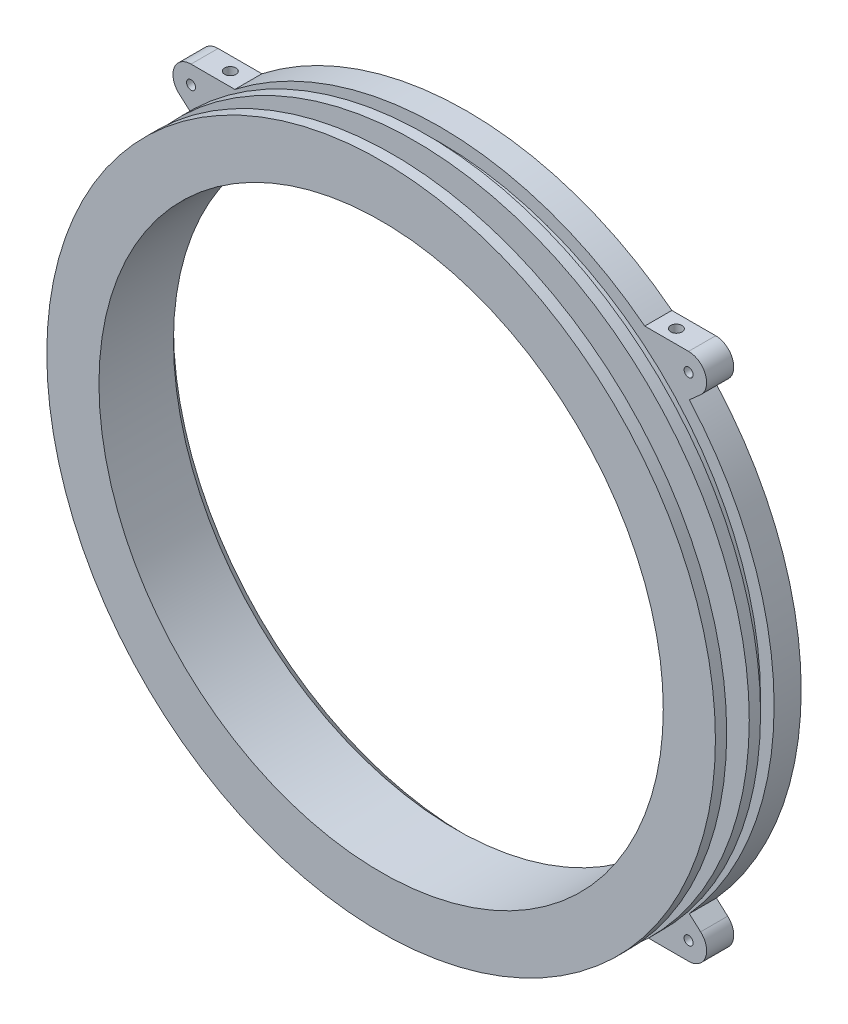
ISO-10303-21;
HEADER;
FILE_DESCRIPTION(('STEP AP214'),'2;1');
FILE_NAME('part.step','',(''),(''),'','','');
FILE_SCHEMA(('AUTOMOTIVE_DESIGN { 1 0 10303 214 1 1 1 1 }'));
ENDSEC;
DATA;
#1=APPLICATION_CONTEXT('core data for automotive mechanical design processes');
#2=APPLICATION_PROTOCOL_DEFINITION('international standard','automotive_design',2000,#1);
#3=PRODUCT_CONTEXT('',#1,'mechanical');
#4=PRODUCT('Part','Part','',(#3));
#5=PRODUCT_RELATED_PRODUCT_CATEGORY('part','',(#4));
#6=PRODUCT_DEFINITION_FORMATION('','',#4);
#7=PRODUCT_DEFINITION_CONTEXT('part definition',#1,'design');
#8=PRODUCT_DEFINITION('design','',#6,#7);
#9=PRODUCT_DEFINITION_SHAPE('','',#8);
#10=(LENGTH_UNIT() NAMED_UNIT(*) SI_UNIT(.MILLI.,.METRE.));
#11=(NAMED_UNIT(*) PLANE_ANGLE_UNIT() SI_UNIT($,.RADIAN.));
#12=(NAMED_UNIT(*) SI_UNIT($,.STERADIAN.) SOLID_ANGLE_UNIT());
#13=UNCERTAINTY_MEASURE_WITH_UNIT(LENGTH_MEASURE(1.E-05),#10,'distance_accuracy_value','');
#14=(GEOMETRIC_REPRESENTATION_CONTEXT(3) GLOBAL_UNCERTAINTY_ASSIGNED_CONTEXT((#13)) GLOBAL_UNIT_ASSIGNED_CONTEXT((#10,
#11,#12)) REPRESENTATION_CONTEXT('',''));
#15=CARTESIAN_POINT('',(0.,0.,0.));
#16=DIRECTION('',(0.,0.,1.));
#17=DIRECTION('',(1.,0.,0.));
#18=AXIS2_PLACEMENT_3D('',#15,#16,#17);
#19=CARTESIAN_POINT('',(0.,0.,12.));
#20=DIRECTION('',(0.,0.,-1.));
#21=DIRECTION('',(-1.,0.,0.));
#22=AXIS2_PLACEMENT_3D('',#19,#20,#21);
#23=CYLINDRICAL_SURFACE('',#22,148.1);
#24=DIRECTION('',(0.,0.,-1.));
#25=VECTOR('',#24,1.);
#26=CARTESIAN_POINT('',(-110.532726589017,-98.5704131714865,12.));
#27=LINE('',#26,#25);
#28=CARTESIAN_POINT('',(-110.532726589017,-98.5704131714865,12.));
#29=VERTEX_POINT('',#28);
#30=CARTESIAN_POINT('',(-110.532726589017,-98.5704131714865,0.));
#31=VERTEX_POINT('',#30);
#32=EDGE_CURVE('E63',#29,#31,#27,.T.);
#33=ORIENTED_EDGE('',*,*,#32,.F.);
#34=CARTESIAN_POINT('',(0.,0.,12.));
#35=DIRECTION('',(0.,0.,1.));
#36=DIRECTION('',(1.,0.,0.));
#37=AXIS2_PLACEMENT_3D('',#34,#35,#36);
#38=CIRCLE('',#37,148.1);
#39=CARTESIAN_POINT('',(-110.532726589017,98.5704131714865,12.));
#40=VERTEX_POINT('',#39);
#41=EDGE_CURVE('E161',#40,#29,#38,.T.);
#42=ORIENTED_EDGE('',*,*,#41,.F.);
#43=DIRECTION('',(0.,0.,-1.));
#44=VECTOR('',#43,1.);
#45=CARTESIAN_POINT('',(-110.532726589017,98.5704131714865,12.));
#46=LINE('',#45,#44);
#47=CARTESIAN_POINT('',(-110.532726589017,98.5704131714865,0.));
#48=VERTEX_POINT('',#47);
#49=EDGE_CURVE('E272',#40,#48,#46,.T.);
#50=ORIENTED_EDGE('',*,*,#49,.T.);
#51=CARTESIAN_POINT('',(0.,0.,0.));
#52=DIRECTION('',(0.,0.,1.));
#53=DIRECTION('',(1.,0.,0.));
#54=AXIS2_PLACEMENT_3D('',#51,#52,#53);
#55=CIRCLE('',#54,148.1);
#56=EDGE_CURVE('E318',#48,#31,#55,.T.);
#57=ORIENTED_EDGE('',*,*,#56,.T.);
#58=EDGE_LOOP('',(#33,#42,#50,#57));
#59=FACE_BOUND('',#58,.T.);
#60=ADVANCED_FACE('F40',(#59),#23,.T.);
#61=DIRECTION('',(0.,0.,-1.));
#62=VECTOR('',#61,1.);
#63=CARTESIAN_POINT('',(-90.7998348016119,-117.,12.));
#64=LINE('',#63,#62);
#65=CARTESIAN_POINT('',(-90.7998348016119,-117.,12.));
#66=VERTEX_POINT('',#65);
#67=CARTESIAN_POINT('',(-90.7998348016119,-117.,0.));
#68=VERTEX_POINT('',#67);
#69=EDGE_CURVE('E179',#66,#68,#64,.T.);
#70=ORIENTED_EDGE('',*,*,#69,.T.);
#71=CARTESIAN_POINT('',(90.7998348016119,-117.,0.));
#72=VERTEX_POINT('',#71);
#73=EDGE_CURVE('E319',#68,#72,#55,.T.);
#74=ORIENTED_EDGE('',*,*,#73,.T.);
#75=DIRECTION('',(0.,0.,-1.));
#76=VECTOR('',#75,1.);
#77=CARTESIAN_POINT('',(90.799834801612,-117.,12.));
#78=LINE('',#77,#76);
#79=CARTESIAN_POINT('',(90.7998348016119,-117.,12.));
#80=VERTEX_POINT('',#79);
#81=EDGE_CURVE('E217',#80,#72,#78,.T.);
#82=ORIENTED_EDGE('',*,*,#81,.F.);
#83=EDGE_CURVE('E55',#66,#80,#38,.T.);
#84=ORIENTED_EDGE('',*,*,#83,.F.);
#85=EDGE_LOOP('',(#70,#74,#82,#84));
#86=FACE_BOUND('',#85,.T.);
#87=ADVANCED_FACE('F337',(#86),#23,.T.);
#88=DIRECTION('',(0.,0.,-1.));
#89=VECTOR('',#88,1.);
#90=CARTESIAN_POINT('',(110.532726589017,-98.5704131714865,12.));
#91=LINE('',#90,#89);
#92=CARTESIAN_POINT('',(110.532726589017,-98.5704131714865,12.));
#93=VERTEX_POINT('',#92);
#94=CARTESIAN_POINT('',(110.532726589017,-98.5704131714865,0.));
#95=VERTEX_POINT('',#94);
#96=EDGE_CURVE('E220',#93,#95,#91,.T.);
#97=ORIENTED_EDGE('',*,*,#96,.T.);
#98=CARTESIAN_POINT('',(110.532726589017,98.5704131714865,0.));
#99=VERTEX_POINT('',#98);
#100=EDGE_CURVE('E353',#95,#99,#55,.T.);
#101=ORIENTED_EDGE('',*,*,#100,.T.);
#102=DIRECTION('',(0.,0.,-1.));
#103=VECTOR('',#102,1.);
#104=CARTESIAN_POINT('',(110.532726589017,98.5704131714865,12.));
#105=LINE('',#104,#103);
#106=CARTESIAN_POINT('',(110.532726589017,98.5704131714865,12.));
#107=VERTEX_POINT('',#106);
#108=EDGE_CURVE('E255',#107,#99,#105,.T.);
#109=ORIENTED_EDGE('',*,*,#108,.F.);
#110=EDGE_CURVE('E355',#93,#107,#38,.T.);
#111=ORIENTED_EDGE('',*,*,#110,.F.);
#112=EDGE_LOOP('',(#97,#101,#109,#111));
#113=FACE_BOUND('',#112,.T.);
#114=ADVANCED_FACE('F338',(#113),#23,.T.);
#115=DIRECTION('',(0.,0.,-1.));
#116=VECTOR('',#115,1.);
#117=CARTESIAN_POINT('',(90.7998348016119,117.,12.));
#118=LINE('',#117,#116);
#119=CARTESIAN_POINT('',(90.7998348016119,117.,12.));
#120=VERTEX_POINT('',#119);
#121=CARTESIAN_POINT('',(90.7998348016119,117.,0.));
#122=VERTEX_POINT('',#121);
#123=EDGE_CURVE('E241',#120,#122,#118,.T.);
#124=ORIENTED_EDGE('',*,*,#123,.T.);
#125=CARTESIAN_POINT('',(-90.7998348016119,117.,0.));
#126=VERTEX_POINT('',#125);
#127=EDGE_CURVE('E312',#122,#126,#55,.T.);
#128=ORIENTED_EDGE('',*,*,#127,.T.);
#129=DIRECTION('',(0.,0.,-1.));
#130=VECTOR('',#129,1.);
#131=CARTESIAN_POINT('',(-90.7998348016119,117.,12.));
#132=LINE('',#131,#130);
#133=CARTESIAN_POINT('',(-90.7998348016119,117.,12.));
#134=VERTEX_POINT('',#133);
#135=EDGE_CURVE('E285',#134,#126,#132,.T.);
#136=ORIENTED_EDGE('',*,*,#135,.F.);
#137=EDGE_CURVE('E317',#120,#134,#38,.T.);
#138=ORIENTED_EDGE('',*,*,#137,.F.);
#139=EDGE_LOOP('',(#124,#128,#136,#138));
#140=FACE_BOUND('',#139,.T.);
#141=ADVANCED_FACE('F342',(#140),#23,.T.);
#142=CARTESIAN_POINT('',(0.,0.,23.));
#143=DIRECTION('',(0.,0.,1.));
#144=DIRECTION('',(1.,0.,0.));
#145=AXIS2_PLACEMENT_3D('',#142,#143,#144);
#146=PLANE('',#145);
#147=CARTESIAN_POINT('',(0.,0.,23.));
#148=DIRECTION('',(0.,0.,1.));
#149=DIRECTION('',(1.,0.,0.));
#150=AXIS2_PLACEMENT_3D('',#147,#148,#149);
#151=CIRCLE('',#150,148.1);
#152=CARTESIAN_POINT('',(148.1,0.,23.));
#153=VERTEX_POINT('',#152);
#154=EDGE_CURVE('E304',#153,#153,#151,.T.);
#155=ORIENTED_EDGE('',*,*,#154,.T.);
#156=EDGE_LOOP('',(#155));
#157=FACE_BOUND('',#156,.T.);
#158=CARTESIAN_POINT('',(0.,0.,23.));
#159=DIRECTION('',(0.,0.,1.));
#160=DIRECTION('',(1.,0.,0.));
#161=AXIS2_PLACEMENT_3D('',#158,#159,#160);
#162=CIRCLE('',#161,133.1);
#163=CARTESIAN_POINT('',(133.1,0.,23.));
#164=VERTEX_POINT('',#163);
#165=EDGE_CURVE('E295',#164,#164,#162,.T.);
#166=ORIENTED_EDGE('',*,*,#165,.F.);
#167=EDGE_LOOP('',(#166));
#168=FACE_BOUND('',#167,.T.);
#169=ADVANCED_FACE('F349',(#157,#168),#146,.T.);
#170=CARTESIAN_POINT('',(0.,0.,12.));
#171=DIRECTION('',(0.,0.,1.));
#172=DIRECTION('',(1.,0.,0.));
#173=AXIS2_PLACEMENT_3D('',#170,#171,#172);
#174=PLANE('',#173);
#175=CARTESIAN_POINT('',(0.,0.,12.));
#176=DIRECTION('',(0.,0.,1.));
#177=DIRECTION('',(1.,0.,0.));
#178=AXIS2_PLACEMENT_3D('',#175,#176,#177);
#179=CIRCLE('',#178,142.1);
#180=CARTESIAN_POINT('',(142.1,0.,12.));
#181=VERTEX_POINT('',#180);
#182=EDGE_CURVE('E313',#181,#181,#179,.T.);
#183=ORIENTED_EDGE('',*,*,#182,.F.);
#184=EDGE_LOOP('',(#183));
#185=FACE_BOUND('',#184,.T.);
#186=ORIENTED_EDGE('',*,*,#41,.T.);
#187=DIRECTION('',(-0.746338464476822,-0.6655665980519,0.));
#188=VECTOR('',#187,1.);
#189=CARTESIAN_POINT('',(-115.532726589017,-103.029292284185,12.));
#190=LINE('',#189,#188);
#191=CARTESIAN_POINT('',(-115.532726589017,-103.029292284185,12.));
#192=VERTEX_POINT('',#191);
#193=EDGE_CURVE('E153',#29,#192,#190,.T.);
#194=ORIENTED_EDGE('',*,*,#193,.T.);
#195=CARTESIAN_POINT('',(-110.208193804602,-109.,12.));
#196=DIRECTION('',(0.,0.,1.));
#197=DIRECTION('',(-1.,0.,0.));
#198=AXIS2_PLACEMENT_3D('',#195,#196,#197);
#199=CIRCLE('',#198,7.99999999999999);
#200=CARTESIAN_POINT('',(-110.208193804602,-117.,12.));
#201=VERTEX_POINT('',#200);
#202=EDGE_CURVE('E158',#192,#201,#199,.T.);
#203=ORIENTED_EDGE('',*,*,#202,.T.);
#204=DIRECTION('',(1.,0.,0.));
#205=VECTOR('',#204,1.);
#206=CARTESIAN_POINT('',(-90.7998348016119,-117.,12.));
#207=LINE('',#206,#205);
#208=EDGE_CURVE('E177',#201,#66,#207,.T.);
#209=ORIENTED_EDGE('',*,*,#208,.T.);
#210=ORIENTED_EDGE('',*,*,#83,.T.);
#211=DIRECTION('',(1.,0.,0.));
#212=VECTOR('',#211,1.);
#213=CARTESIAN_POINT('',(90.7998348016119,-117.,12.));
#214=LINE('',#213,#212);
#215=CARTESIAN_POINT('',(110.208193804602,-117.,12.));
#216=VERTEX_POINT('',#215);
#217=EDGE_CURVE('E206',#80,#216,#214,.T.);
#218=ORIENTED_EDGE('',*,*,#217,.T.);
#219=CARTESIAN_POINT('',(110.208193804602,-109.,12.));
#220=DIRECTION('',(0.,0.,1.));
#221=DIRECTION('',(1.,0.,0.));
#222=AXIS2_PLACEMENT_3D('',#219,#220,#221);
#223=CIRCLE('',#222,7.99999999999999);
#224=CARTESIAN_POINT('',(115.532726589017,-103.029292284185,12.));
#225=VERTEX_POINT('',#224);
#226=EDGE_CURVE('E199',#216,#225,#223,.T.);
#227=ORIENTED_EDGE('',*,*,#226,.T.);
#228=DIRECTION('',(-0.746338464476822,0.6655665980519,0.));
#229=VECTOR('',#228,1.);
#230=CARTESIAN_POINT('',(115.532726589017,-103.029292284185,12.));
#231=LINE('',#230,#229);
#232=EDGE_CURVE('E202',#225,#93,#231,.T.);
#233=ORIENTED_EDGE('',*,*,#232,.T.);
#234=ORIENTED_EDGE('',*,*,#110,.T.);
#235=DIRECTION('',(0.746338464476822,0.6655665980519,0.));
#236=VECTOR('',#235,1.);
#237=CARTESIAN_POINT('',(115.532726589017,103.029292284185,12.));
#238=LINE('',#237,#236);
#239=CARTESIAN_POINT('',(115.532726589017,103.029292284185,12.));
#240=VERTEX_POINT('',#239);
#241=EDGE_CURVE('E233',#107,#240,#238,.T.);
#242=ORIENTED_EDGE('',*,*,#241,.T.);
#243=CARTESIAN_POINT('',(110.208193804602,109.,12.));
#244=DIRECTION('',(0.,0.,1.));
#245=DIRECTION('',(-1.,0.,0.));
#246=AXIS2_PLACEMENT_3D('',#243,#244,#245);
#247=CIRCLE('',#246,7.99999999999999);
#248=CARTESIAN_POINT('',(110.208193804602,117.,12.));
#249=VERTEX_POINT('',#248);
#250=EDGE_CURVE('E235',#240,#249,#247,.T.);
#251=ORIENTED_EDGE('',*,*,#250,.T.);
#252=DIRECTION('',(-1.,0.,0.));
#253=VECTOR('',#252,1.);
#254=CARTESIAN_POINT('',(90.7998348016119,117.,12.));
#255=LINE('',#254,#253);
#256=EDGE_CURVE('E238',#249,#120,#255,.T.);
#257=ORIENTED_EDGE('',*,*,#256,.T.);
#258=ORIENTED_EDGE('',*,*,#137,.T.);
#259=DIRECTION('',(-1.,0.,0.));
#260=VECTOR('',#259,1.);
#261=CARTESIAN_POINT('',(-90.7998348016119,117.,12.));
#262=LINE('',#261,#260);
#263=CARTESIAN_POINT('',(-110.208193804602,117.,12.));
#264=VERTEX_POINT('',#263);
#265=EDGE_CURVE('E265',#134,#264,#262,.T.);
#266=ORIENTED_EDGE('',*,*,#265,.T.);
#267=CARTESIAN_POINT('',(-110.208193804602,109.,12.));
#268=DIRECTION('',(0.,0.,1.));
#269=DIRECTION('',(1.,0.,0.));
#270=AXIS2_PLACEMENT_3D('',#267,#268,#269);
#271=CIRCLE('',#270,7.99999999999999);
#272=CARTESIAN_POINT('',(-115.532726589017,103.029292284185,12.));
#273=VERTEX_POINT('',#272);
#274=EDGE_CURVE('E267',#264,#273,#271,.T.);
#275=ORIENTED_EDGE('',*,*,#274,.T.);
#276=DIRECTION('',(0.746338464476822,-0.6655665980519,0.));
#277=VECTOR('',#276,1.);
#278=CARTESIAN_POINT('',(-115.532726589017,103.029292284185,12.));
#279=LINE('',#278,#277);
#280=EDGE_CURVE('E270',#273,#40,#279,.T.);
#281=ORIENTED_EDGE('',*,*,#280,.T.);
#282=EDGE_LOOP('',(#186,#194,#203,#209,#210,#218,#227,#233,#234,#242,#251,#257,#258,#266,#275,#281));
#283=FACE_BOUND('',#282,.T.);
#284=CARTESIAN_POINT('',(-110.208193804602,109.,12.));
#285=DIRECTION('',(0.,0.,1.));
#286=DIRECTION('',(1.,0.,0.));
#287=AXIS2_PLACEMENT_3D('',#284,#285,#286);
#288=CIRCLE('',#287,2.);
#289=CARTESIAN_POINT('',(-108.208193804602,109.,12.));
#290=VERTEX_POINT('',#289);
#291=EDGE_CURVE('E259',#290,#290,#288,.T.);
#292=ORIENTED_EDGE('',*,*,#291,.F.);
#293=EDGE_LOOP('',(#292));
#294=FACE_BOUND('',#293,.T.);
#295=CARTESIAN_POINT('',(110.208193804602,109.,12.));
#296=DIRECTION('',(0.,0.,1.));
#297=DIRECTION('',(-1.,0.,0.));
#298=AXIS2_PLACEMENT_3D('',#295,#296,#297);
#299=CIRCLE('',#298,2.);
#300=CARTESIAN_POINT('',(108.208193804602,109.,12.));
#301=VERTEX_POINT('',#300);
#302=EDGE_CURVE('E227',#301,#301,#299,.T.);
#303=ORIENTED_EDGE('',*,*,#302,.F.);
#304=EDGE_LOOP('',(#303));
#305=FACE_BOUND('',#304,.T.);
#306=CARTESIAN_POINT('',(110.208193804602,-109.,12.));
#307=DIRECTION('',(0.,0.,1.));
#308=DIRECTION('',(1.,0.,0.));
#309=AXIS2_PLACEMENT_3D('',#306,#307,#308);
#310=CIRCLE('',#309,2.);
#311=CARTESIAN_POINT('',(112.208193804602,-109.,12.));
#312=VERTEX_POINT('',#311);
#313=EDGE_CURVE('E193',#312,#312,#310,.T.);
#314=ORIENTED_EDGE('',*,*,#313,.F.);
#315=EDGE_LOOP('',(#314));
#316=FACE_BOUND('',#315,.T.);
#317=CARTESIAN_POINT('',(-110.208193804602,-109.,12.));
#318=DIRECTION('',(0.,0.,1.));
#319=DIRECTION('',(-1.,0.,0.));
#320=AXIS2_PLACEMENT_3D('',#317,#318,#319);
#321=CIRCLE('',#320,2.);
#322=CARTESIAN_POINT('',(-112.208193804602,-109.,12.));
#323=VERTEX_POINT('',#322);
#324=EDGE_CURVE('E185',#323,#323,#321,.T.);
#325=ORIENTED_EDGE('',*,*,#324,.F.);
#326=EDGE_LOOP('',(#325));
#327=FACE_BOUND('',#326,.T.);
#328=ADVANCED_FACE('F155',(#185,#283,#294,#305,#316,#327),#174,.T.);
#329=CARTESIAN_POINT('',(0.,0.,0.));
#330=DIRECTION('',(0.,0.,1.));
#331=DIRECTION('',(1.,0.,0.));
#332=AXIS2_PLACEMENT_3D('',#329,#330,#331);
#333=PLANE('',#332);
#334=CARTESIAN_POINT('',(0.,0.,0.));
#335=DIRECTION('',(0.,0.,1.));
#336=DIRECTION('',(1.,0.,0.));
#337=AXIS2_PLACEMENT_3D('',#334,#335,#336);
#338=CIRCLE('',#337,130.);
#339=CARTESIAN_POINT('',(130.,0.,0.));
#340=VERTEX_POINT('',#339);
#341=EDGE_CURVE('E48',#340,#340,#338,.T.);
#342=ORIENTED_EDGE('',*,*,#341,.T.);
#343=EDGE_LOOP('',(#342));
#344=FACE_BOUND('',#343,.T.);
#345=ORIENTED_EDGE('',*,*,#56,.F.);
#346=DIRECTION('',(0.746338464476822,-0.6655665980519,0.));
#347=VECTOR('',#346,1.);
#348=CARTESIAN_POINT('',(-115.532726589017,103.029292284185,0.));
#349=LINE('',#348,#347);
#350=CARTESIAN_POINT('',(-115.532726589017,103.029292284185,0.));
#351=VERTEX_POINT('',#350);
#352=EDGE_CURVE('E268',#351,#48,#349,.T.);
#353=ORIENTED_EDGE('',*,*,#352,.F.);
#354=CARTESIAN_POINT('',(-110.208193804602,109.,0.));
#355=DIRECTION('',(0.,0.,1.));
#356=DIRECTION('',(1.,0.,0.));
#357=AXIS2_PLACEMENT_3D('',#354,#355,#356);
#358=CIRCLE('',#357,7.99999999999999);
#359=CARTESIAN_POINT('',(-110.208193804602,117.,0.));
#360=VERTEX_POINT('',#359);
#361=EDGE_CURVE('E274',#360,#351,#358,.T.);
#362=ORIENTED_EDGE('',*,*,#361,.F.);
#363=DIRECTION('',(-1.,0.,0.));
#364=VECTOR('',#363,1.);
#365=CARTESIAN_POINT('',(-90.7998348016119,117.,0.));
#366=LINE('',#365,#364);
#367=EDGE_CURVE('E262',#126,#360,#366,.T.);
#368=ORIENTED_EDGE('',*,*,#367,.F.);
#369=ORIENTED_EDGE('',*,*,#127,.F.);
#370=DIRECTION('',(-1.,0.,0.));
#371=VECTOR('',#370,1.);
#372=CARTESIAN_POINT('',(90.7998348016119,117.,0.));
#373=LINE('',#372,#371);
#374=CARTESIAN_POINT('',(110.208193804602,117.,0.));
#375=VERTEX_POINT('',#374);
#376=EDGE_CURVE('E236',#375,#122,#373,.T.);
#377=ORIENTED_EDGE('',*,*,#376,.F.);
#378=CARTESIAN_POINT('',(110.208193804602,109.,0.));
#379=DIRECTION('',(0.,0.,1.));
#380=DIRECTION('',(-1.,0.,0.));
#381=AXIS2_PLACEMENT_3D('',#378,#379,#380);
#382=CIRCLE('',#381,7.99999999999999);
#383=CARTESIAN_POINT('',(115.532726589017,103.029292284185,0.));
#384=VERTEX_POINT('',#383);
#385=EDGE_CURVE('E243',#384,#375,#382,.T.);
#386=ORIENTED_EDGE('',*,*,#385,.F.);
#387=DIRECTION('',(0.746338464476822,0.6655665980519,0.));
#388=VECTOR('',#387,1.);
#389=CARTESIAN_POINT('',(115.532726589017,103.029292284185,0.));
#390=LINE('',#389,#388);
#391=EDGE_CURVE('E230',#99,#384,#390,.T.);
#392=ORIENTED_EDGE('',*,*,#391,.F.);
#393=ORIENTED_EDGE('',*,*,#100,.F.);
#394=DIRECTION('',(-0.746338464476822,0.6655665980519,0.));
#395=VECTOR('',#394,1.);
#396=CARTESIAN_POINT('',(115.532726589017,-103.029292284185,0.));
#397=LINE('',#396,#395);
#398=CARTESIAN_POINT('',(115.532726589017,-103.029292284185,0.));
#399=VERTEX_POINT('',#398);
#400=EDGE_CURVE('E211',#399,#95,#397,.T.);
#401=ORIENTED_EDGE('',*,*,#400,.F.);
#402=CARTESIAN_POINT('',(110.208193804602,-109.,0.));
#403=DIRECTION('',(0.,0.,1.));
#404=DIRECTION('',(1.,0.,0.));
#405=AXIS2_PLACEMENT_3D('',#402,#403,#404);
#406=CIRCLE('',#405,7.99999999999999);
#407=CARTESIAN_POINT('',(110.208193804602,-117.,0.));
#408=VERTEX_POINT('',#407);
#409=EDGE_CURVE('E196',#408,#399,#406,.T.);
#410=ORIENTED_EDGE('',*,*,#409,.F.);
#411=DIRECTION('',(1.,0.,0.));
#412=VECTOR('',#411,1.);
#413=CARTESIAN_POINT('',(90.7998348016119,-117.,0.));
#414=LINE('',#413,#412);
#415=EDGE_CURVE('E203',#72,#408,#414,.T.);
#416=ORIENTED_EDGE('',*,*,#415,.F.);
#417=ORIENTED_EDGE('',*,*,#73,.F.);
#418=DIRECTION('',(1.,0.,0.));
#419=VECTOR('',#418,1.);
#420=CARTESIAN_POINT('',(-90.7998348016119,-117.,0.));
#421=LINE('',#420,#419);
#422=CARTESIAN_POINT('',(-110.208193804602,-117.,0.));
#423=VERTEX_POINT('',#422);
#424=EDGE_CURVE('E163',#423,#68,#421,.T.);
#425=ORIENTED_EDGE('',*,*,#424,.F.);
#426=CARTESIAN_POINT('',(-110.208193804602,-109.,0.));
#427=DIRECTION('',(0.,0.,1.));
#428=DIRECTION('',(-1.,0.,0.));
#429=AXIS2_PLACEMENT_3D('',#426,#427,#428);
#430=CIRCLE('',#429,7.99999999999999);
#431=CARTESIAN_POINT('',(-115.532726589017,-103.029292284185,0.));
#432=VERTEX_POINT('',#431);
#433=EDGE_CURVE('E184',#432,#423,#430,.T.);
#434=ORIENTED_EDGE('',*,*,#433,.F.);
#435=DIRECTION('',(-0.746338464476822,-0.6655665980519,0.));
#436=VECTOR('',#435,1.);
#437=CARTESIAN_POINT('',(-115.532726589017,-103.029292284185,0.));
#438=LINE('',#437,#436);
#439=EDGE_CURVE('E169',#31,#432,#438,.T.);
#440=ORIENTED_EDGE('',*,*,#439,.F.);
#441=EDGE_LOOP('',(#345,#353,#362,#368,#369,#377,#386,#392,#393,#401,#410,#416,#417,#425,#434,#440));
#442=FACE_BOUND('',#441,.T.);
#443=CARTESIAN_POINT('',(-110.208193804602,109.,0.));
#444=DIRECTION('',(0.,0.,1.));
#445=DIRECTION('',(1.,0.,0.));
#446=AXIS2_PLACEMENT_3D('',#443,#444,#445);
#447=CIRCLE('',#446,2.);
#448=CARTESIAN_POINT('',(-108.208193804602,109.,0.));
#449=VERTEX_POINT('',#448);
#450=EDGE_CURVE('E258',#449,#449,#447,.T.);
#451=ORIENTED_EDGE('',*,*,#450,.T.);
#452=EDGE_LOOP('',(#451));
#453=FACE_BOUND('',#452,.T.);
#454=CARTESIAN_POINT('',(110.208193804602,109.,0.));
#455=DIRECTION('',(0.,0.,1.));
#456=DIRECTION('',(-1.,0.,0.));
#457=AXIS2_PLACEMENT_3D('',#454,#455,#456);
#458=CIRCLE('',#457,2.);
#459=CARTESIAN_POINT('',(108.208193804602,109.,0.));
#460=VERTEX_POINT('',#459);
#461=EDGE_CURVE('E226',#460,#460,#458,.T.);
#462=ORIENTED_EDGE('',*,*,#461,.T.);
#463=EDGE_LOOP('',(#462));
#464=FACE_BOUND('',#463,.T.);
#465=CARTESIAN_POINT('',(110.208193804602,-109.,0.));
#466=DIRECTION('',(0.,0.,1.));
#467=DIRECTION('',(1.,0.,0.));
#468=AXIS2_PLACEMENT_3D('',#465,#466,#467);
#469=CIRCLE('',#468,2.);
#470=CARTESIAN_POINT('',(112.208193804602,-109.,0.));
#471=VERTEX_POINT('',#470);
#472=EDGE_CURVE('E192',#471,#471,#469,.T.);
#473=ORIENTED_EDGE('',*,*,#472,.T.);
#474=EDGE_LOOP('',(#473));
#475=FACE_BOUND('',#474,.T.);
#476=CARTESIAN_POINT('',(-110.208193804602,-109.,0.));
#477=DIRECTION('',(0.,0.,1.));
#478=DIRECTION('',(-1.,0.,0.));
#479=AXIS2_PLACEMENT_3D('',#476,#477,#478);
#480=CIRCLE('',#479,2.);
#481=CARTESIAN_POINT('',(-112.208193804602,-109.,0.));
#482=VERTEX_POINT('',#481);
#483=EDGE_CURVE('E707',#482,#482,#480,.T.);
#484=ORIENTED_EDGE('',*,*,#483,.T.);
#485=EDGE_LOOP('',(#484));
#486=FACE_BOUND('',#485,.T.);
#487=ADVANCED_FACE('F323',(#344,#442,#453,#464,#475,#486),#333,.F.);
#488=CARTESIAN_POINT('',(0.,0.,12.));
#489=DIRECTION('',(0.,0.,-1.));
#490=DIRECTION('',(-1.,0.,0.));
#491=AXIS2_PLACEMENT_3D('',#488,#489,#490);
#492=CYLINDRICAL_SURFACE('',#491,125.);
#493=CARTESIAN_POINT('',(0.,0.,5.00000000000006));
#494=DIRECTION('',(0.,0.,1.));
#495=DIRECTION('',(1.,0.,0.));
#496=AXIS2_PLACEMENT_3D('',#493,#494,#495);
#497=CIRCLE('',#496,125.);
#498=CARTESIAN_POINT('',(125.,0.,5.00000000000006));
#499=VERTEX_POINT('',#498);
#500=EDGE_CURVE('E11',#499,#499,#497,.F.);
#501=ORIENTED_EDGE('',*,*,#500,.T.);
#502=EDGE_LOOP('',(#501));
#503=FACE_BOUND('',#502,.T.);
#504=CARTESIAN_POINT('',(0.,0.,38.));
#505=DIRECTION('',(0.,0.,1.));
#506=DIRECTION('',(1.,0.,0.));
#507=AXIS2_PLACEMENT_3D('',#504,#505,#506);
#508=CIRCLE('',#507,125.);
#509=CARTESIAN_POINT('',(125.,0.,38.));
#510=VERTEX_POINT('',#509);
#511=EDGE_CURVE('E288',#510,#510,#508,.T.);
#512=ORIENTED_EDGE('',*,*,#511,.T.);
#513=EDGE_LOOP('',(#512));
#514=FACE_BOUND('',#513,.T.);
#515=ADVANCED_FACE('F454',(#503,#514),#492,.F.);
#516=CARTESIAN_POINT('',(0.,0.,18.));
#517=DIRECTION('',(0.,0.,-1.));
#518=DIRECTION('',(-1.,0.,0.));
#519=AXIS2_PLACEMENT_3D('',#516,#517,#518);
#520=CYLINDRICAL_SURFACE('',#519,142.1);
#521=CARTESIAN_POINT('',(0.,0.,18.));
#522=DIRECTION('',(0.,0.,1.));
#523=DIRECTION('',(1.,0.,0.));
#524=AXIS2_PLACEMENT_3D('',#521,#522,#523);
#525=CIRCLE('',#524,142.1);
#526=CARTESIAN_POINT('',(142.1,0.,18.));
#527=VERTEX_POINT('',#526);
#528=EDGE_CURVE('E307',#527,#527,#525,.T.);
#529=ORIENTED_EDGE('',*,*,#528,.F.);
#530=EDGE_LOOP('',(#529));
#531=FACE_BOUND('',#530,.T.);
#532=ORIENTED_EDGE('',*,*,#182,.T.);
#533=EDGE_LOOP('',(#532));
#534=FACE_BOUND('',#533,.T.);
#535=ADVANCED_FACE('F447',(#531,#534),#520,.T.);
#536=CARTESIAN_POINT('',(0.,0.,18.));
#537=DIRECTION('',(0.,0.,1.));
#538=DIRECTION('',(1.,0.,0.));
#539=AXIS2_PLACEMENT_3D('',#536,#537,#538);
#540=PLANE('',#539);
#541=ORIENTED_EDGE('',*,*,#528,.T.);
#542=EDGE_LOOP('',(#541));
#543=FACE_BOUND('',#542,.T.);
#544=CARTESIAN_POINT('',(0.,0.,18.));
#545=DIRECTION('',(0.,0.,1.));
#546=DIRECTION('',(1.,0.,0.));
#547=AXIS2_PLACEMENT_3D('',#544,#545,#546);
#548=CIRCLE('',#547,148.1);
#549=CARTESIAN_POINT('',(148.1,0.,18.));
#550=VERTEX_POINT('',#549);
#551=EDGE_CURVE('E301',#550,#550,#548,.T.);
#552=ORIENTED_EDGE('',*,*,#551,.F.);
#553=EDGE_LOOP('',(#552));
#554=FACE_BOUND('',#553,.T.);
#555=ADVANCED_FACE('F444',(#543,#554),#540,.F.);
#556=CARTESIAN_POINT('',(0.,0.,23.));
#557=DIRECTION('',(0.,0.,-1.));
#558=DIRECTION('',(-1.,0.,0.));
#559=AXIS2_PLACEMENT_3D('',#556,#557,#558);
#560=CYLINDRICAL_SURFACE('',#559,148.1);
#561=ORIENTED_EDGE('',*,*,#154,.F.);
#562=EDGE_LOOP('',(#561));
#563=FACE_BOUND('',#562,.T.);
#564=ORIENTED_EDGE('',*,*,#551,.T.);
#565=EDGE_LOOP('',(#564));
#566=FACE_BOUND('',#565,.T.);
#567=ADVANCED_FACE('F439',(#563,#566),#560,.T.);
#568=CARTESIAN_POINT('',(0.,0.,33.));
#569=DIRECTION('',(0.,0.,-1.));
#570=DIRECTION('',(-1.,0.,0.));
#571=AXIS2_PLACEMENT_3D('',#568,#569,#570);
#572=CYLINDRICAL_SURFACE('',#571,133.1);
#573=CARTESIAN_POINT('',(0.,0.,33.));
#574=DIRECTION('',(0.,0.,1.));
#575=DIRECTION('',(1.,0.,0.));
#576=AXIS2_PLACEMENT_3D('',#573,#574,#575);
#577=CIRCLE('',#576,133.1);
#578=CARTESIAN_POINT('',(133.1,0.,33.));
#579=VERTEX_POINT('',#578);
#580=EDGE_CURVE('E298',#579,#579,#577,.T.);
#581=ORIENTED_EDGE('',*,*,#580,.F.);
#582=EDGE_LOOP('',(#581));
#583=FACE_BOUND('',#582,.T.);
#584=ORIENTED_EDGE('',*,*,#165,.T.);
#585=EDGE_LOOP('',(#584));
#586=FACE_BOUND('',#585,.T.);
#587=ADVANCED_FACE('F429',(#583,#586),#572,.T.);
#588=CARTESIAN_POINT('',(0.,0.,38.));
#589=DIRECTION('',(0.,0.,1.));
#590=DIRECTION('',(1.,0.,0.));
#591=AXIS2_PLACEMENT_3D('',#588,#589,#590);
#592=PLANE('',#591);
#593=CARTESIAN_POINT('',(0.,0.,38.));
#594=DIRECTION('',(0.,0.,1.));
#595=DIRECTION('',(1.,0.,0.));
#596=AXIS2_PLACEMENT_3D('',#593,#594,#595);
#597=CIRCLE('',#596,148.1);
#598=CARTESIAN_POINT('',(148.1,0.,38.));
#599=VERTEX_POINT('',#598);
#600=EDGE_CURVE('E292',#599,#599,#597,.T.);
#601=ORIENTED_EDGE('',*,*,#600,.T.);
#602=EDGE_LOOP('',(#601));
#603=FACE_BOUND('',#602,.T.);
#604=ORIENTED_EDGE('',*,*,#511,.F.);
#605=EDGE_LOOP('',(#604));
#606=FACE_BOUND('',#605,.T.);
#607=ADVANCED_FACE('F425',(#603,#606),#592,.T.);
#608=CARTESIAN_POINT('',(0.,0.,33.));
#609=DIRECTION('',(0.,0.,1.));
#610=DIRECTION('',(1.,0.,0.));
#611=AXIS2_PLACEMENT_3D('',#608,#609,#610);
#612=PLANE('',#611);
#613=ORIENTED_EDGE('',*,*,#580,.T.);
#614=EDGE_LOOP('',(#613));
#615=FACE_BOUND('',#614,.T.);
#616=CARTESIAN_POINT('',(0.,0.,33.));
#617=DIRECTION('',(0.,0.,1.));
#618=DIRECTION('',(1.,0.,0.));
#619=AXIS2_PLACEMENT_3D('',#616,#617,#618);
#620=CIRCLE('',#619,148.1);
#621=CARTESIAN_POINT('',(148.1,0.,33.));
#622=VERTEX_POINT('',#621);
#623=EDGE_CURVE('E291',#622,#622,#620,.T.);
#624=ORIENTED_EDGE('',*,*,#623,.F.);
#625=EDGE_LOOP('',(#624));
#626=FACE_BOUND('',#625,.T.);
#627=ADVANCED_FACE('F428',(#615,#626),#612,.F.);
#628=CARTESIAN_POINT('',(0.,0.,38.));
#629=DIRECTION('',(0.,0.,-1.));
#630=DIRECTION('',(-1.,0.,0.));
#631=AXIS2_PLACEMENT_3D('',#628,#629,#630);
#632=CYLINDRICAL_SURFACE('',#631,148.1);
#633=ORIENTED_EDGE('',*,*,#600,.F.);
#634=EDGE_LOOP('',(#633));
#635=FACE_BOUND('',#634,.T.);
#636=ORIENTED_EDGE('',*,*,#623,.T.);
#637=EDGE_LOOP('',(#636));
#638=FACE_BOUND('',#637,.T.);
#639=ADVANCED_FACE('F423',(#635,#638),#632,.T.);
#640=CARTESIAN_POINT('',(-90.7998348016119,117.,12.));
#641=DIRECTION('',(0.,-1.,0.));
#642=DIRECTION('',(0.,0.,-1.));
#643=AXIS2_PLACEMENT_3D('',#640,#641,#642);
#644=PLANE('',#643);
#645=CARTESIAN_POINT('',(-98.7998348016119,117.,6.));
#646=DIRECTION('',(0.,1.,0.));
#647=DIRECTION('',(0.,0.,1.));
#648=AXIS2_PLACEMENT_3D('',#645,#646,#647);
#649=CIRCLE('',#648,2.5);
#650=CARTESIAN_POINT('',(-98.7998348016119,117.,8.49999999999999));
#651=VERTEX_POINT('',#650);
#652=EDGE_CURVE('E701',#651,#651,#649,.T.);
#653=ORIENTED_EDGE('',*,*,#652,.F.);
#654=EDGE_LOOP('',(#653));
#655=FACE_BOUND('',#654,.T.);
#656=ORIENTED_EDGE('',*,*,#367,.T.);
#657=DIRECTION('',(0.,0.,-1.));
#658=VECTOR('',#657,1.);
#659=CARTESIAN_POINT('',(-110.208193804602,117.,12.));
#660=LINE('',#659,#658);
#661=EDGE_CURVE('E282',#264,#360,#660,.T.);
#662=ORIENTED_EDGE('',*,*,#661,.F.);
#663=ORIENTED_EDGE('',*,*,#265,.F.);
#664=ORIENTED_EDGE('',*,*,#135,.T.);
#665=EDGE_LOOP('',(#656,#662,#663,#664));
#666=FACE_BOUND('',#665,.T.);
#667=ADVANCED_FACE('F373',(#655,#666),#644,.F.);
#668=CARTESIAN_POINT('',(-110.208193804602,109.,12.));
#669=DIRECTION('',(0.,0.,-1.));
#670=DIRECTION('',(-1.,0.,0.));
#671=AXIS2_PLACEMENT_3D('',#668,#669,#670);
#672=CYLINDRICAL_SURFACE('',#671,7.99999999999999);
#673=ORIENTED_EDGE('',*,*,#361,.T.);
#674=DIRECTION('',(0.,0.,-1.));
#675=VECTOR('',#674,1.);
#676=CARTESIAN_POINT('',(-115.532726589017,103.029292284185,12.));
#677=LINE('',#676,#675);
#678=EDGE_CURVE('E279',#273,#351,#677,.T.);
#679=ORIENTED_EDGE('',*,*,#678,.F.);
#680=ORIENTED_EDGE('',*,*,#274,.F.);
#681=ORIENTED_EDGE('',*,*,#661,.T.);
#682=EDGE_LOOP('',(#673,#679,#680,#681));
#683=FACE_BOUND('',#682,.T.);
#684=ADVANCED_FACE('F416',(#683),#672,.T.);
#685=CARTESIAN_POINT('',(-115.532726589017,103.029292284185,12.));
#686=DIRECTION('',(0.6655665980519,0.746338464476822,0.));
#687=DIRECTION('',(-0.746338464476822,0.6655665980519,0.));
#688=AXIS2_PLACEMENT_3D('',#685,#686,#687);
#689=PLANE('',#688);
#690=ORIENTED_EDGE('',*,*,#352,.T.);
#691=ORIENTED_EDGE('',*,*,#49,.F.);
#692=ORIENTED_EDGE('',*,*,#280,.F.);
#693=ORIENTED_EDGE('',*,*,#678,.T.);
#694=EDGE_LOOP('',(#690,#691,#692,#693));
#695=FACE_BOUND('',#694,.T.);
#696=ADVANCED_FACE('F412',(#695),#689,.F.);
#697=CARTESIAN_POINT('',(-110.208193804602,109.,12.));
#698=DIRECTION('',(0.,0.,-1.));
#699=DIRECTION('',(-1.,0.,0.));
#700=AXIS2_PLACEMENT_3D('',#697,#698,#699);
#701=CYLINDRICAL_SURFACE('',#700,2.);
#702=ORIENTED_EDGE('',*,*,#291,.T.);
#703=EDGE_LOOP('',(#702));
#704=FACE_BOUND('',#703,.T.);
#705=ORIENTED_EDGE('',*,*,#450,.F.);
#706=EDGE_LOOP('',(#705));
#707=FACE_BOUND('',#706,.T.);
#708=ADVANCED_FACE('F408',(#704,#707),#701,.F.);
#709=CARTESIAN_POINT('',(115.532726589017,103.029292284185,12.));
#710=DIRECTION('',(-0.6655665980519,0.746338464476822,0.));
#711=DIRECTION('',(-0.746338464476822,-0.6655665980519,0.));
#712=AXIS2_PLACEMENT_3D('',#709,#710,#711);
#713=PLANE('',#712);
#714=ORIENTED_EDGE('',*,*,#391,.T.);
#715=DIRECTION('',(0.,0.,-1.));
#716=VECTOR('',#715,1.);
#717=CARTESIAN_POINT('',(115.532726589017,103.029292284185,12.));
#718=LINE('',#717,#716);
#719=EDGE_CURVE('E252',#240,#384,#718,.T.);
#720=ORIENTED_EDGE('',*,*,#719,.F.);
#721=ORIENTED_EDGE('',*,*,#241,.F.);
#722=ORIENTED_EDGE('',*,*,#108,.T.);
#723=EDGE_LOOP('',(#714,#720,#721,#722));
#724=FACE_BOUND('',#723,.T.);
#725=ADVANCED_FACE('F404',(#724),#713,.F.);
#726=CARTESIAN_POINT('',(110.208193804602,109.,12.));
#727=DIRECTION('',(0.,0.,-1.));
#728=DIRECTION('',(-1.,0.,0.));
#729=AXIS2_PLACEMENT_3D('',#726,#727,#728);
#730=CYLINDRICAL_SURFACE('',#729,7.99999999999999);
#731=ORIENTED_EDGE('',*,*,#385,.T.);
#732=DIRECTION('',(0.,0.,-1.));
#733=VECTOR('',#732,1.);
#734=CARTESIAN_POINT('',(110.208193804602,117.,12.));
#735=LINE('',#734,#733);
#736=EDGE_CURVE('E249',#249,#375,#735,.T.);
#737=ORIENTED_EDGE('',*,*,#736,.F.);
#738=ORIENTED_EDGE('',*,*,#250,.F.);
#739=ORIENTED_EDGE('',*,*,#719,.T.);
#740=EDGE_LOOP('',(#731,#737,#738,#739));
#741=FACE_BOUND('',#740,.T.);
#742=ADVANCED_FACE('F400',(#741),#730,.T.);
#743=CARTESIAN_POINT('',(90.7998348016119,117.,12.));
#744=DIRECTION('',(0.,-1.,0.));
#745=DIRECTION('',(0.,0.,-1.));
#746=AXIS2_PLACEMENT_3D('',#743,#744,#745);
#747=PLANE('',#746);
#748=CARTESIAN_POINT('',(98.7998348016119,117.,6.));
#749=DIRECTION('',(0.,-1.,0.));
#750=DIRECTION('',(0.,0.,1.));
#751=AXIS2_PLACEMENT_3D('',#748,#749,#750);
#752=CIRCLE('',#751,2.5);
#753=CARTESIAN_POINT('',(98.7998348016119,117.,8.49999999999999));
#754=VERTEX_POINT('',#753);
#755=EDGE_CURVE('E691',#754,#754,#752,.T.);
#756=ORIENTED_EDGE('',*,*,#755,.T.);
#757=EDGE_LOOP('',(#756));
#758=FACE_BOUND('',#757,.T.);
#759=ORIENTED_EDGE('',*,*,#376,.T.);
#760=ORIENTED_EDGE('',*,*,#123,.F.);
#761=ORIENTED_EDGE('',*,*,#256,.F.);
#762=ORIENTED_EDGE('',*,*,#736,.T.);
#763=EDGE_LOOP('',(#759,#760,#761,#762));
#764=FACE_BOUND('',#763,.T.);
#765=ADVANCED_FACE('F393',(#758,#764),#747,.F.);
#766=CARTESIAN_POINT('',(110.208193804602,109.,12.));
#767=DIRECTION('',(0.,0.,-1.));
#768=DIRECTION('',(-1.,0.,0.));
#769=AXIS2_PLACEMENT_3D('',#766,#767,#768);
#770=CYLINDRICAL_SURFACE('',#769,2.);
#771=ORIENTED_EDGE('',*,*,#302,.T.);
#772=EDGE_LOOP('',(#771));
#773=FACE_BOUND('',#772,.T.);
#774=ORIENTED_EDGE('',*,*,#461,.F.);
#775=EDGE_LOOP('',(#774));
#776=FACE_BOUND('',#775,.T.);
#777=ADVANCED_FACE('F386',(#773,#776),#770,.F.);
#778=CARTESIAN_POINT('',(110.208193804602,-109.,12.));
#779=DIRECTION('',(0.,0.,-1.));
#780=DIRECTION('',(-1.,0.,0.));
#781=AXIS2_PLACEMENT_3D('',#778,#779,#780);
#782=CYLINDRICAL_SURFACE('',#781,7.99999999999999);
#783=ORIENTED_EDGE('',*,*,#409,.T.);
#784=DIRECTION('',(0.,0.,-1.));
#785=VECTOR('',#784,1.);
#786=CARTESIAN_POINT('',(115.532726589017,-103.029292284185,12.));
#787=LINE('',#786,#785);
#788=EDGE_CURVE('E223',#225,#399,#787,.T.);
#789=ORIENTED_EDGE('',*,*,#788,.F.);
#790=ORIENTED_EDGE('',*,*,#226,.F.);
#791=DIRECTION('',(0.,0.,-1.));
#792=VECTOR('',#791,1.);
#793=CARTESIAN_POINT('',(110.208193804602,-117.,12.));
#794=LINE('',#793,#792);
#795=EDGE_CURVE('E208',#216,#408,#794,.T.);
#796=ORIENTED_EDGE('',*,*,#795,.T.);
#797=EDGE_LOOP('',(#783,#789,#790,#796));
#798=FACE_BOUND('',#797,.T.);
#799=ADVANCED_FACE('F384',(#798),#782,.T.);
#800=CARTESIAN_POINT('',(115.532726589017,-103.029292284185,12.));
#801=DIRECTION('',(-0.6655665980519,-0.746338464476822,0.));
#802=DIRECTION('',(0.746338464476822,-0.6655665980519,0.));
#803=AXIS2_PLACEMENT_3D('',#800,#801,#802);
#804=PLANE('',#803);
#805=ORIENTED_EDGE('',*,*,#400,.T.);
#806=ORIENTED_EDGE('',*,*,#96,.F.);
#807=ORIENTED_EDGE('',*,*,#232,.F.);
#808=ORIENTED_EDGE('',*,*,#788,.T.);
#809=EDGE_LOOP('',(#805,#806,#807,#808));
#810=FACE_BOUND('',#809,.T.);
#811=ADVANCED_FACE('F357',(#810),#804,.F.);
#812=CARTESIAN_POINT('',(90.7998348016119,-117.,12.));
#813=DIRECTION('',(0.,1.,0.));
#814=DIRECTION('',(0.,0.,1.));
#815=AXIS2_PLACEMENT_3D('',#812,#813,#814);
#816=PLANE('',#815);
#817=CARTESIAN_POINT('',(98.7998348016119,-117.,6.));
#818=DIRECTION('',(0.,-1.,0.));
#819=DIRECTION('',(0.,0.,1.));
#820=AXIS2_PLACEMENT_3D('',#817,#818,#819);
#821=CIRCLE('',#820,2.5);
#822=CARTESIAN_POINT('',(98.7998348016119,-117.,8.49999999999999));
#823=VERTEX_POINT('',#822);
#824=EDGE_CURVE('E685',#823,#823,#821,.T.);
#825=ORIENTED_EDGE('',*,*,#824,.F.);
#826=EDGE_LOOP('',(#825));
#827=FACE_BOUND('',#826,.T.);
#828=ORIENTED_EDGE('',*,*,#415,.T.);
#829=ORIENTED_EDGE('',*,*,#795,.F.);
#830=ORIENTED_EDGE('',*,*,#217,.F.);
#831=ORIENTED_EDGE('',*,*,#81,.T.);
#832=EDGE_LOOP('',(#828,#829,#830,#831));
#833=FACE_BOUND('',#832,.T.);
#834=ADVANCED_FACE('F381',(#827,#833),#816,.F.);
#835=CARTESIAN_POINT('',(110.208193804602,-109.,12.));
#836=DIRECTION('',(0.,0.,-1.));
#837=DIRECTION('',(-1.,0.,0.));
#838=AXIS2_PLACEMENT_3D('',#835,#836,#837);
#839=CYLINDRICAL_SURFACE('',#838,2.);
#840=ORIENTED_EDGE('',*,*,#313,.T.);
#841=EDGE_LOOP('',(#840));
#842=FACE_BOUND('',#841,.T.);
#843=ORIENTED_EDGE('',*,*,#472,.F.);
#844=EDGE_LOOP('',(#843));
#845=FACE_BOUND('',#844,.T.);
#846=ADVANCED_FACE('F553',(#842,#845),#839,.F.);
#847=CARTESIAN_POINT('',(-115.532726589017,-103.029292284185,12.));
#848=DIRECTION('',(0.6655665980519,-0.746338464476822,0.));
#849=DIRECTION('',(0.746338464476822,0.6655665980519,0.));
#850=AXIS2_PLACEMENT_3D('',#847,#848,#849);
#851=PLANE('',#850);
#852=ORIENTED_EDGE('',*,*,#439,.T.);
#853=DIRECTION('',(0.,0.,-1.));
#854=VECTOR('',#853,1.);
#855=CARTESIAN_POINT('',(-115.532726589017,-103.029292284185,12.));
#856=LINE('',#855,#854);
#857=EDGE_CURVE('E166',#192,#432,#856,.T.);
#858=ORIENTED_EDGE('',*,*,#857,.F.);
#859=ORIENTED_EDGE('',*,*,#193,.F.);
#860=ORIENTED_EDGE('',*,*,#32,.T.);
#861=EDGE_LOOP('',(#852,#858,#859,#860));
#862=FACE_BOUND('',#861,.T.);
#863=ADVANCED_FACE('F167',(#862),#851,.F.);
#864=CARTESIAN_POINT('',(-110.208193804602,-109.,12.));
#865=DIRECTION('',(0.,0.,-1.));
#866=DIRECTION('',(-1.,0.,0.));
#867=AXIS2_PLACEMENT_3D('',#864,#865,#866);
#868=CYLINDRICAL_SURFACE('',#867,7.99999999999999);
#869=ORIENTED_EDGE('',*,*,#433,.T.);
#870=DIRECTION('',(0.,0.,-1.));
#871=VECTOR('',#870,1.);
#872=CARTESIAN_POINT('',(-110.208193804602,-117.,12.));
#873=LINE('',#872,#871);
#874=EDGE_CURVE('E172',#201,#423,#873,.T.);
#875=ORIENTED_EDGE('',*,*,#874,.F.);
#876=ORIENTED_EDGE('',*,*,#202,.F.);
#877=ORIENTED_EDGE('',*,*,#857,.T.);
#878=EDGE_LOOP('',(#869,#875,#876,#877));
#879=FACE_BOUND('',#878,.T.);
#880=ADVANCED_FACE('F174',(#879),#868,.T.);
#881=CARTESIAN_POINT('',(-90.7998348016119,-117.,12.));
#882=DIRECTION('',(0.,1.,0.));
#883=DIRECTION('',(0.,0.,1.));
#884=AXIS2_PLACEMENT_3D('',#881,#882,#883);
#885=PLANE('',#884);
#886=CARTESIAN_POINT('',(-98.7998348016119,-117.,6.));
#887=DIRECTION('',(0.,1.,0.));
#888=DIRECTION('',(0.,0.,1.));
#889=AXIS2_PLACEMENT_3D('',#886,#887,#888);
#890=CIRCLE('',#889,2.5);
#891=CARTESIAN_POINT('',(-98.7998348016119,-117.,8.49999999999999));
#892=VERTEX_POINT('',#891);
#893=EDGE_CURVE('E694',#892,#892,#890,.T.);
#894=ORIENTED_EDGE('',*,*,#893,.T.);
#895=EDGE_LOOP('',(#894));
#896=FACE_BOUND('',#895,.T.);
#897=ORIENTED_EDGE('',*,*,#424,.T.);
#898=ORIENTED_EDGE('',*,*,#69,.F.);
#899=ORIENTED_EDGE('',*,*,#208,.F.);
#900=ORIENTED_EDGE('',*,*,#874,.T.);
#901=EDGE_LOOP('',(#897,#898,#899,#900));
#902=FACE_BOUND('',#901,.T.);
#903=ADVANCED_FACE('F574',(#896,#902),#885,.F.);
#904=CARTESIAN_POINT('',(-110.208193804602,-109.,12.));
#905=DIRECTION('',(0.,0.,-1.));
#906=DIRECTION('',(-1.,0.,0.));
#907=AXIS2_PLACEMENT_3D('',#904,#905,#906);
#908=CYLINDRICAL_SURFACE('',#907,2.);
#909=ORIENTED_EDGE('',*,*,#324,.T.);
#910=EDGE_LOOP('',(#909));
#911=FACE_BOUND('',#910,.T.);
#912=ORIENTED_EDGE('',*,*,#483,.F.);
#913=EDGE_LOOP('',(#912));
#914=FACE_BOUND('',#913,.T.);
#915=ADVANCED_FACE('F581',(#911,#914),#908,.F.);
#916=CARTESIAN_POINT('',(-98.7998348016119,102.,6.));
#917=DIRECTION('',(0.,1.,0.));
#918=DIRECTION('',(0.,0.,1.));
#919=AXIS2_PLACEMENT_3D('',#916,#917,#918);
#920=CYLINDRICAL_SURFACE('',#919,2.5);
#921=CARTESIAN_POINT('',(-98.7998348016119,102.,6.));
#922=DIRECTION('',(0.,1.,0.));
#923=DIRECTION('',(0.,0.,1.));
#924=AXIS2_PLACEMENT_3D('',#921,#922,#923);
#925=CIRCLE('',#924,2.5);
#926=CARTESIAN_POINT('',(-98.7998348016119,102.,8.49999999999999));
#927=VERTEX_POINT('',#926);
#928=EDGE_CURVE('E704',#927,#927,#925,.T.);
#929=ORIENTED_EDGE('',*,*,#928,.F.);
#930=EDGE_LOOP('',(#929));
#931=FACE_BOUND('',#930,.T.);
#932=ORIENTED_EDGE('',*,*,#652,.T.);
#933=EDGE_LOOP('',(#932));
#934=FACE_BOUND('',#933,.T.);
#935=ADVANCED_FACE('F585',(#931,#934),#920,.F.);
#936=CARTESIAN_POINT('',(-98.7998348016119,102.,6.));
#937=DIRECTION('',(0.,1.,0.));
#938=DIRECTION('',(0.,0.,1.));
#939=AXIS2_PLACEMENT_3D('',#936,#937,#938);
#940=PLANE('',#939);
#941=ORIENTED_EDGE('',*,*,#928,.T.);
#942=EDGE_LOOP('',(#941));
#943=FACE_BOUND('',#942,.T.);
#944=ADVANCED_FACE('F598',(#943),#940,.T.);
#945=CARTESIAN_POINT('',(98.7998348016119,102.,6.));
#946=DIRECTION('',(0.,1.,0.));
#947=DIRECTION('',(0.,0.,1.));
#948=AXIS2_PLACEMENT_3D('',#945,#946,#947);
#949=CYLINDRICAL_SURFACE('',#948,2.5);
#950=CARTESIAN_POINT('',(98.7998348016119,102.,6.));
#951=DIRECTION('',(0.,-1.,0.));
#952=DIRECTION('',(0.,0.,1.));
#953=AXIS2_PLACEMENT_3D('',#950,#951,#952);
#954=CIRCLE('',#953,2.5);
#955=CARTESIAN_POINT('',(98.7998348016119,102.,8.49999999999999));
#956=VERTEX_POINT('',#955);
#957=EDGE_CURVE('E698',#956,#956,#954,.T.);
#958=ORIENTED_EDGE('',*,*,#957,.T.);
#959=EDGE_LOOP('',(#958));
#960=FACE_BOUND('',#959,.T.);
#961=ORIENTED_EDGE('',*,*,#755,.F.);
#962=EDGE_LOOP('',(#961));
#963=FACE_BOUND('',#962,.T.);
#964=ADVANCED_FACE('F605',(#960,#963),#949,.F.);
#965=CARTESIAN_POINT('',(98.7998348016119,102.,6.));
#966=DIRECTION('',(0.,1.,0.));
#967=DIRECTION('',(0.,0.,1.));
#968=AXIS2_PLACEMENT_3D('',#965,#966,#967);
#969=PLANE('',#968);
#970=ORIENTED_EDGE('',*,*,#957,.F.);
#971=EDGE_LOOP('',(#970));
#972=FACE_BOUND('',#971,.T.);
#973=ADVANCED_FACE('F612',(#972),#969,.T.);
#974=CARTESIAN_POINT('',(98.7998348016119,-102.,6.));
#975=DIRECTION('',(0.,-1.,0.));
#976=DIRECTION('',(0.,0.,-1.));
#977=AXIS2_PLACEMENT_3D('',#974,#975,#976);
#978=CYLINDRICAL_SURFACE('',#977,2.5);
#979=CARTESIAN_POINT('',(98.7998348016119,-102.,6.));
#980=DIRECTION('',(0.,-1.,0.));
#981=DIRECTION('',(0.,0.,1.));
#982=AXIS2_PLACEMENT_3D('',#979,#980,#981);
#983=CIRCLE('',#982,2.5);
#984=CARTESIAN_POINT('',(98.7998348016119,-102.,8.49999999999999));
#985=VERTEX_POINT('',#984);
#986=EDGE_CURVE('E687',#985,#985,#983,.T.);
#987=ORIENTED_EDGE('',*,*,#986,.F.);
#988=EDGE_LOOP('',(#987));
#989=FACE_BOUND('',#988,.T.);
#990=ORIENTED_EDGE('',*,*,#824,.T.);
#991=EDGE_LOOP('',(#990));
#992=FACE_BOUND('',#991,.T.);
#993=ADVANCED_FACE('F620',(#989,#992),#978,.F.);
#994=CARTESIAN_POINT('',(98.7998348016119,-102.,6.));
#995=DIRECTION('',(0.,-1.,0.));
#996=DIRECTION('',(0.,0.,1.));
#997=AXIS2_PLACEMENT_3D('',#994,#995,#996);
#998=PLANE('',#997);
#999=ORIENTED_EDGE('',*,*,#986,.T.);
#1000=EDGE_LOOP('',(#999));
#1001=FACE_BOUND('',#1000,.T.);
#1002=ADVANCED_FACE('F628',(#1001),#998,.T.);
#1003=CARTESIAN_POINT('',(-98.7998348016119,-102.,6.));
#1004=DIRECTION('',(0.,-1.,0.));
#1005=DIRECTION('',(0.,0.,-1.));
#1006=AXIS2_PLACEMENT_3D('',#1003,#1004,#1005);
#1007=CYLINDRICAL_SURFACE('',#1006,2.5);
#1008=CARTESIAN_POINT('',(-98.7998348016119,-102.,6.));
#1009=DIRECTION('',(0.,1.,0.));
#1010=DIRECTION('',(0.,0.,1.));
#1011=AXIS2_PLACEMENT_3D('',#1008,#1009,#1010);
#1012=CIRCLE('',#1011,2.5);
#1013=CARTESIAN_POINT('',(-98.7998348016119,-102.,8.49999999999999));
#1014=VERTEX_POINT('',#1013);
#1015=EDGE_CURVE('E688',#1014,#1014,#1012,.T.);
#1016=ORIENTED_EDGE('',*,*,#1015,.T.);
#1017=EDGE_LOOP('',(#1016));
#1018=FACE_BOUND('',#1017,.T.);
#1019=ORIENTED_EDGE('',*,*,#893,.F.);
#1020=EDGE_LOOP('',(#1019));
#1021=FACE_BOUND('',#1020,.T.);
#1022=ADVANCED_FACE('F332',(#1018,#1021),#1007,.F.);
#1023=CARTESIAN_POINT('',(-98.7998348016119,-102.,6.));
#1024=DIRECTION('',(0.,-1.,0.));
#1025=DIRECTION('',(0.,0.,1.));
#1026=AXIS2_PLACEMENT_3D('',#1023,#1024,#1025);
#1027=PLANE('',#1026);
#1028=ORIENTED_EDGE('',*,*,#1015,.F.);
#1029=EDGE_LOOP('',(#1028));
#1030=FACE_BOUND('',#1029,.T.);
#1031=ADVANCED_FACE('F327',(#1030),#1027,.T.);
#1032=CARTESIAN_POINT('',(0.,0.,0.));
#1033=DIRECTION('',(0.,0.,-1.));
#1034=DIRECTION('',(-1.,0.,0.));
#1035=AXIS2_PLACEMENT_3D('',#1032,#1033,#1034);
#1036=CONICAL_SURFACE('',#1035,130.,0.785398163397446);
#1037=ORIENTED_EDGE('',*,*,#500,.F.);
#1038=EDGE_LOOP('',(#1037));
#1039=FACE_BOUND('',#1038,.T.);
#1040=ORIENTED_EDGE('',*,*,#341,.F.);
#1041=EDGE_LOOP('',(#1040));
#1042=FACE_BOUND('',#1041,.T.);
#1043=ADVANCED_FACE('F42',(#1039,#1042),#1036,.F.);
#1044=CLOSED_SHELL('',(#60,#87,#114,#141,#169,#328,#487,#515,#535,#555,#567,#587,#607,#627,#639,
#667,#684,#696,#708,#725,#742,#765,#777,#799,#811,#834,#846,#863,#880,#903,#915,#935,#944,#964,
#973,#993,#1002,#1022,#1031,#1043));
#1045=MANIFOLD_SOLID_BREP('B2',#1044);
#1046=ADVANCED_BREP_SHAPE_REPRESENTATION('',(#18,#1045),#14);
#1047=SHAPE_DEFINITION_REPRESENTATION(#9,#1046);
ENDSEC;
END-ISO-10303-21;
